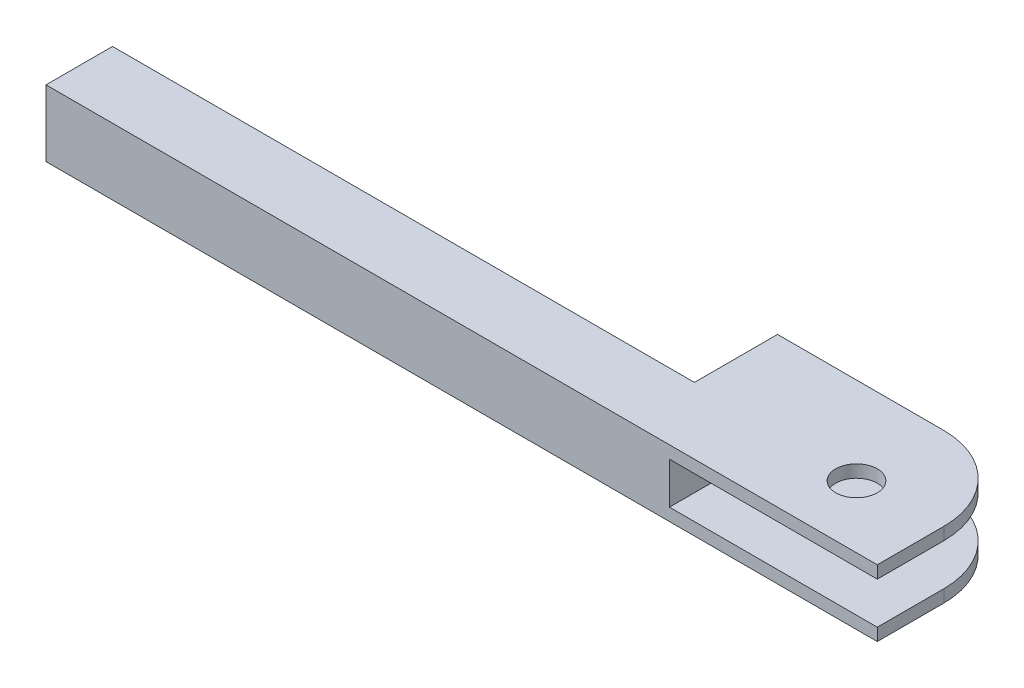
ISO-10303-21;
HEADER;
FILE_DESCRIPTION(('STEP AP214'),'2;1');
FILE_NAME('part.step','',(''),(''),'','','');
FILE_SCHEMA(('AUTOMOTIVE_DESIGN { 1 0 10303 214 1 1 1 1 }'));
ENDSEC;
DATA;
#1=APPLICATION_CONTEXT('core data for automotive mechanical design processes');
#2=APPLICATION_PROTOCOL_DEFINITION('international standard','automotive_design',2000,#1);
#3=PRODUCT_CONTEXT('',#1,'mechanical');
#4=PRODUCT('Part','Part','',(#3));
#5=PRODUCT_RELATED_PRODUCT_CATEGORY('part','',(#4));
#6=PRODUCT_DEFINITION_FORMATION('','',#4);
#7=PRODUCT_DEFINITION_CONTEXT('part definition',#1,'design');
#8=PRODUCT_DEFINITION('design','',#6,#7);
#9=PRODUCT_DEFINITION_SHAPE('','',#8);
#10=(LENGTH_UNIT() NAMED_UNIT(*) SI_UNIT(.MILLI.,.METRE.));
#11=(NAMED_UNIT(*) PLANE_ANGLE_UNIT() SI_UNIT($,.RADIAN.));
#12=(NAMED_UNIT(*) SI_UNIT($,.STERADIAN.) SOLID_ANGLE_UNIT());
#13=UNCERTAINTY_MEASURE_WITH_UNIT(LENGTH_MEASURE(1.E-05),#10,'distance_accuracy_value','');
#14=(GEOMETRIC_REPRESENTATION_CONTEXT(3) GLOBAL_UNCERTAINTY_ASSIGNED_CONTEXT((#13)) GLOBAL_UNIT_ASSIGNED_CONTEXT((#10,
#11,#12)) REPRESENTATION_CONTEXT('',''));
#15=CARTESIAN_POINT('',(0.,0.,0.));
#16=DIRECTION('',(0.,0.,1.));
#17=DIRECTION('',(1.,0.,0.));
#18=AXIS2_PLACEMENT_3D('',#15,#16,#17);
#19=CARTESIAN_POINT('',(100.,8.,-18.));
#20=DIRECTION('',(1.,0.,0.));
#21=DIRECTION('',(0.,0.,-1.));
#22=AXIS2_PLACEMENT_3D('',#19,#20,#21);
#23=PLANE('',#22);
#24=DIRECTION('',(0.,0.,1.));
#25=VECTOR('',#24,1.);
#26=CARTESIAN_POINT('',(100.,0.,-18.));
#27=LINE('',#26,#25);
#28=CARTESIAN_POINT('',(100.,0.,-8.));
#29=VERTEX_POINT('',#28);
#30=CARTESIAN_POINT('',(100.,0.,0.));
#31=VERTEX_POINT('',#30);
#32=EDGE_CURVE('E200',#29,#31,#27,.T.);
#33=ORIENTED_EDGE('',*,*,#32,.F.);
#34=DIRECTION('',(0.,-1.,0.));
#35=VECTOR('',#34,1.);
#36=CARTESIAN_POINT('',(100.,8.,-8.));
#37=LINE('',#36,#35);
#38=CARTESIAN_POINT('',(100.,1.5,-8.));
#39=VERTEX_POINT('',#38);
#40=EDGE_CURVE('E174',#29,#39,#37,.F.);
#41=ORIENTED_EDGE('',*,*,#40,.T.);
#42=DIRECTION('',(0.,0.,1.));
#43=VECTOR('',#42,1.);
#44=CARTESIAN_POINT('',(100.,1.5,-35.));
#45=LINE('',#44,#43);
#46=CARTESIAN_POINT('',(100.,1.5,0.));
#47=VERTEX_POINT('',#46);
#48=EDGE_CURVE('E185',#39,#47,#45,.T.);
#49=ORIENTED_EDGE('',*,*,#48,.T.);
#50=DIRECTION('',(0.,-1.,0.));
#51=VECTOR('',#50,1.);
#52=CARTESIAN_POINT('',(100.,8.,0.));
#53=LINE('',#52,#51);
#54=EDGE_CURVE('E141',#47,#31,#53,.T.);
#55=ORIENTED_EDGE('',*,*,#54,.T.);
#56=EDGE_LOOP('',(#33,#41,#49,#55));
#57=FACE_BOUND('',#56,.T.);
#58=ADVANCED_FACE('F33',(#57),#23,.T.);
#59=CARTESIAN_POINT('',(0.,8.,0.));
#60=DIRECTION('',(-1.,0.,0.));
#61=DIRECTION('',(0.,0.,1.));
#62=AXIS2_PLACEMENT_3D('',#59,#60,#61);
#63=PLANE('',#62);
#64=DIRECTION('',(0.,0.,-1.));
#65=VECTOR('',#64,1.);
#66=CARTESIAN_POINT('',(0.,0.,0.));
#67=LINE('',#66,#65);
#68=CARTESIAN_POINT('',(0.,0.,0.));
#69=VERTEX_POINT('',#68);
#70=CARTESIAN_POINT('',(0.,0.,-8.));
#71=VERTEX_POINT('',#70);
#72=EDGE_CURVE('E216',#69,#71,#67,.T.);
#73=ORIENTED_EDGE('',*,*,#72,.F.);
#74=DIRECTION('',(0.,-1.,0.));
#75=VECTOR('',#74,1.);
#76=CARTESIAN_POINT('',(0.,8.,0.));
#77=LINE('',#76,#75);
#78=CARTESIAN_POINT('',(0.,8.,0.));
#79=VERTEX_POINT('',#78);
#80=EDGE_CURVE('E140',#79,#69,#77,.T.);
#81=ORIENTED_EDGE('',*,*,#80,.F.);
#82=DIRECTION('',(0.,0.,-1.));
#83=VECTOR('',#82,1.);
#84=CARTESIAN_POINT('',(0.,8.,0.));
#85=LINE('',#84,#83);
#86=CARTESIAN_POINT('',(0.,8.,-8.));
#87=VERTEX_POINT('',#86);
#88=EDGE_CURVE('E208',#79,#87,#85,.T.);
#89=ORIENTED_EDGE('',*,*,#88,.T.);
#90=DIRECTION('',(0.,-1.,0.));
#91=VECTOR('',#90,1.);
#92=CARTESIAN_POINT('',(0.,8.,-8.));
#93=LINE('',#92,#91);
#94=EDGE_CURVE('E152',#87,#71,#93,.T.);
#95=ORIENTED_EDGE('',*,*,#94,.T.);
#96=EDGE_LOOP('',(#73,#81,#89,#95));
#97=FACE_BOUND('',#96,.T.);
#98=ADVANCED_FACE('F263',(#97),#63,.T.);
#99=CARTESIAN_POINT('',(100.,8.,0.));
#100=DIRECTION('',(0.,0.,1.));
#101=DIRECTION('',(1.,0.,0.));
#102=AXIS2_PLACEMENT_3D('',#99,#100,#101);
#103=PLANE('',#102);
#104=DIRECTION('',(1.,0.,0.));
#105=VECTOR('',#104,1.);
#106=CARTESIAN_POINT('',(100.,1.5,0.));
#107=LINE('',#106,#105);
#108=CARTESIAN_POINT('',(75.,1.5,0.));
#109=VERTEX_POINT('',#108);
#110=EDGE_CURVE('E125',#109,#47,#107,.T.);
#111=ORIENTED_EDGE('',*,*,#110,.F.);
#112=DIRECTION('',(0.,-1.,0.));
#113=VECTOR('',#112,1.);
#114=CARTESIAN_POINT('',(75.,6.5,0.));
#115=LINE('',#114,#113);
#116=CARTESIAN_POINT('',(75.,6.5,0.));
#117=VERTEX_POINT('',#116);
#118=EDGE_CURVE('E135',#117,#109,#115,.T.);
#119=ORIENTED_EDGE('',*,*,#118,.F.);
#120=DIRECTION('',(-1.,0.,0.));
#121=VECTOR('',#120,1.);
#122=CARTESIAN_POINT('',(100.,6.5,0.));
#123=LINE('',#122,#121);
#124=CARTESIAN_POINT('',(100.,6.5,0.));
#125=VERTEX_POINT('',#124);
#126=EDGE_CURVE('E121',#125,#117,#123,.T.);
#127=ORIENTED_EDGE('',*,*,#126,.F.);
#128=CARTESIAN_POINT('',(100.,8.,0.));
#129=VERTEX_POINT('',#128);
#130=EDGE_CURVE('E132',#129,#125,#53,.T.);
#131=ORIENTED_EDGE('',*,*,#130,.F.);
#132=DIRECTION('',(-1.,0.,0.));
#133=VECTOR('',#132,1.);
#134=CARTESIAN_POINT('',(100.,8.,0.));
#135=LINE('',#134,#133);
#136=EDGE_CURVE('E154',#129,#79,#135,.T.);
#137=ORIENTED_EDGE('',*,*,#136,.T.);
#138=ORIENTED_EDGE('',*,*,#80,.T.);
#139=DIRECTION('',(-1.,0.,0.));
#140=VECTOR('',#139,1.);
#141=CARTESIAN_POINT('',(100.,0.,0.));
#142=LINE('',#141,#140);
#143=EDGE_CURVE('E206',#31,#69,#142,.T.);
#144=ORIENTED_EDGE('',*,*,#143,.F.);
#145=ORIENTED_EDGE('',*,*,#54,.F.);
#146=EDGE_LOOP('',(#111,#119,#127,#131,#137,#138,#144,#145));
#147=FACE_BOUND('',#146,.T.);
#148=ADVANCED_FACE('F130',(#147),#103,.T.);
#149=DIRECTION('',(0.,0.,1.));
#150=VECTOR('',#149,1.);
#151=CARTESIAN_POINT('',(100.,6.5,-35.));
#152=LINE('',#151,#150);
#153=CARTESIAN_POINT('',(100.,6.5,-8.));
#154=VERTEX_POINT('',#153);
#155=EDGE_CURVE('E118',#154,#125,#152,.T.);
#156=ORIENTED_EDGE('',*,*,#155,.F.);
#157=DIRECTION('',(0.,-1.,0.));
#158=VECTOR('',#157,1.);
#159=CARTESIAN_POINT('',(100.,8.,-8.));
#160=LINE('',#159,#158);
#161=CARTESIAN_POINT('',(100.,8.,-8.));
#162=VERTEX_POINT('',#161);
#163=EDGE_CURVE('E41',#154,#162,#160,.F.);
#164=ORIENTED_EDGE('',*,*,#163,.T.);
#165=DIRECTION('',(0.,0.,1.));
#166=VECTOR('',#165,1.);
#167=CARTESIAN_POINT('',(100.,8.,-18.));
#168=LINE('',#167,#166);
#169=EDGE_CURVE('E139',#162,#129,#168,.T.);
#170=ORIENTED_EDGE('',*,*,#169,.T.);
#171=ORIENTED_EDGE('',*,*,#130,.T.);
#172=EDGE_LOOP('',(#156,#164,#170,#171));
#173=FACE_BOUND('',#172,.T.);
#174=ADVANCED_FACE('F138',(#173),#23,.T.);
#175=CARTESIAN_POINT('',(70.,8.,-18.));
#176=DIRECTION('',(0.,0.,-1.));
#177=DIRECTION('',(-1.,0.,0.));
#178=AXIS2_PLACEMENT_3D('',#175,#176,#177);
#179=PLANE('',#178);
#180=DIRECTION('',(-1.,0.,0.));
#181=VECTOR('',#180,1.);
#182=CARTESIAN_POINT('',(70.,1.5,-18.));
#183=LINE('',#182,#181);
#184=CARTESIAN_POINT('',(90.,1.5,-18.));
#185=VERTEX_POINT('',#184);
#186=CARTESIAN_POINT('',(75.,1.5,-18.));
#187=VERTEX_POINT('',#186);
#188=EDGE_CURVE('E159',#185,#187,#183,.T.);
#189=ORIENTED_EDGE('',*,*,#188,.F.);
#190=DIRECTION('',(0.,-1.,0.));
#191=VECTOR('',#190,1.);
#192=CARTESIAN_POINT('',(90.,8.,-18.));
#193=LINE('',#192,#191);
#194=CARTESIAN_POINT('',(90.,0.,-18.));
#195=VERTEX_POINT('',#194);
#196=EDGE_CURVE('E169',#185,#195,#193,.T.);
#197=ORIENTED_EDGE('',*,*,#196,.T.);
#198=DIRECTION('',(1.,0.,0.));
#199=VECTOR('',#198,1.);
#200=CARTESIAN_POINT('',(70.,0.,-18.));
#201=LINE('',#200,#199);
#202=CARTESIAN_POINT('',(70.,0.,-18.));
#203=VERTEX_POINT('',#202);
#204=EDGE_CURVE('E202',#203,#195,#201,.T.);
#205=ORIENTED_EDGE('',*,*,#204,.F.);
#206=DIRECTION('',(0.,-1.,0.));
#207=VECTOR('',#206,1.);
#208=CARTESIAN_POINT('',(70.,8.,-18.));
#209=LINE('',#208,#207);
#210=CARTESIAN_POINT('',(70.,8.,-18.));
#211=VERTEX_POINT('',#210);
#212=EDGE_CURVE('E146',#211,#203,#209,.T.);
#213=ORIENTED_EDGE('',*,*,#212,.F.);
#214=DIRECTION('',(1.,0.,0.));
#215=VECTOR('',#214,1.);
#216=CARTESIAN_POINT('',(70.,8.,-18.));
#217=LINE('',#216,#215);
#218=CARTESIAN_POINT('',(90.,8.,-18.));
#219=VERTEX_POINT('',#218);
#220=EDGE_CURVE('E221',#211,#219,#217,.T.);
#221=ORIENTED_EDGE('',*,*,#220,.T.);
#222=DIRECTION('',(0.,-1.,0.));
#223=VECTOR('',#222,1.);
#224=CARTESIAN_POINT('',(90.,8.,-18.));
#225=LINE('',#224,#223);
#226=CARTESIAN_POINT('',(90.,6.5,-18.));
#227=VERTEX_POINT('',#226);
#228=EDGE_CURVE('E161',#219,#227,#225,.T.);
#229=ORIENTED_EDGE('',*,*,#228,.T.);
#230=DIRECTION('',(1.,0.,0.));
#231=VECTOR('',#230,1.);
#232=CARTESIAN_POINT('',(70.,6.5,-18.));
#233=LINE('',#232,#231);
#234=CARTESIAN_POINT('',(75.,6.5,-18.));
#235=VERTEX_POINT('',#234);
#236=EDGE_CURVE('E143',#235,#227,#233,.T.);
#237=ORIENTED_EDGE('',*,*,#236,.F.);
#238=DIRECTION('',(0.,1.,0.));
#239=VECTOR('',#238,1.);
#240=CARTESIAN_POINT('',(75.,8.,-18.));
#241=LINE('',#240,#239);
#242=EDGE_CURVE('E156',#187,#235,#241,.T.);
#243=ORIENTED_EDGE('',*,*,#242,.F.);
#244=EDGE_LOOP('',(#189,#197,#205,#213,#221,#229,#237,#243));
#245=FACE_BOUND('',#244,.T.);
#246=ADVANCED_FACE('F191',(#245),#179,.T.);
#247=CARTESIAN_POINT('',(70.,8.,-8.));
#248=DIRECTION('',(-1.,0.,0.));
#249=DIRECTION('',(0.,0.,1.));
#250=AXIS2_PLACEMENT_3D('',#247,#248,#249);
#251=PLANE('',#250);
#252=DIRECTION('',(0.,0.,-1.));
#253=VECTOR('',#252,1.);
#254=CARTESIAN_POINT('',(70.,0.,-8.));
#255=LINE('',#254,#253);
#256=CARTESIAN_POINT('',(70.,0.,-8.));
#257=VERTEX_POINT('',#256);
#258=EDGE_CURVE('E209',#257,#203,#255,.T.);
#259=ORIENTED_EDGE('',*,*,#258,.F.);
#260=DIRECTION('',(0.,-1.,0.));
#261=VECTOR('',#260,1.);
#262=CARTESIAN_POINT('',(70.,8.,-8.));
#263=LINE('',#262,#261);
#264=CARTESIAN_POINT('',(70.,8.,-8.));
#265=VERTEX_POINT('',#264);
#266=EDGE_CURVE('E150',#265,#257,#263,.T.);
#267=ORIENTED_EDGE('',*,*,#266,.F.);
#268=DIRECTION('',(0.,0.,-1.));
#269=VECTOR('',#268,1.);
#270=CARTESIAN_POINT('',(70.,8.,-8.));
#271=LINE('',#270,#269);
#272=EDGE_CURVE('E224',#265,#211,#271,.T.);
#273=ORIENTED_EDGE('',*,*,#272,.T.);
#274=ORIENTED_EDGE('',*,*,#212,.T.);
#275=EDGE_LOOP('',(#259,#267,#273,#274));
#276=FACE_BOUND('',#275,.T.);
#277=ADVANCED_FACE('F269',(#276),#251,.T.);
#278=CARTESIAN_POINT('',(0.,8.,-8.));
#279=DIRECTION('',(0.,0.,-1.));
#280=DIRECTION('',(-1.,0.,0.));
#281=AXIS2_PLACEMENT_3D('',#278,#279,#280);
#282=PLANE('',#281);
#283=DIRECTION('',(1.,0.,0.));
#284=VECTOR('',#283,1.);
#285=CARTESIAN_POINT('',(0.,0.,-8.));
#286=LINE('',#285,#284);
#287=EDGE_CURVE('E213',#71,#257,#286,.T.);
#288=ORIENTED_EDGE('',*,*,#287,.F.);
#289=ORIENTED_EDGE('',*,*,#94,.F.);
#290=DIRECTION('',(1.,0.,0.));
#291=VECTOR('',#290,1.);
#292=CARTESIAN_POINT('',(0.,8.,-8.));
#293=LINE('',#292,#291);
#294=EDGE_CURVE('E227',#87,#265,#293,.T.);
#295=ORIENTED_EDGE('',*,*,#294,.T.);
#296=ORIENTED_EDGE('',*,*,#266,.T.);
#297=EDGE_LOOP('',(#288,#289,#295,#296));
#298=FACE_BOUND('',#297,.T.);
#299=ADVANCED_FACE('F251',(#298),#282,.T.);
#300=CARTESIAN_POINT('',(0.,8.,0.));
#301=DIRECTION('',(0.,-1.,0.));
#302=DIRECTION('',(0.,0.,-1.));
#303=AXIS2_PLACEMENT_3D('',#300,#301,#302);
#304=PLANE('',#303);
#305=CARTESIAN_POINT('',(90.,8.,-7.5));
#306=DIRECTION('',(0.,1.,0.));
#307=DIRECTION('',(0.,0.,1.));
#308=AXIS2_PLACEMENT_3D('',#305,#306,#307);
#309=CIRCLE('',#308,2.50000000000001);
#310=CARTESIAN_POINT('',(90.,8.,-4.99999999999999));
#311=VERTEX_POINT('',#310);
#312=EDGE_CURVE('E166',#311,#311,#309,.T.);
#313=ORIENTED_EDGE('',*,*,#312,.F.);
#314=EDGE_LOOP('',(#313));
#315=FACE_BOUND('',#314,.T.);
#316=ORIENTED_EDGE('',*,*,#169,.F.);
#317=CARTESIAN_POINT('',(90.,8.,-8.));
#318=DIRECTION('',(0.,-1.,0.));
#319=DIRECTION('',(0.,0.,-1.));
#320=AXIS2_PLACEMENT_3D('',#317,#318,#319);
#321=CIRCLE('',#320,10.);
#322=EDGE_CURVE('E11',#162,#219,#321,.F.);
#323=ORIENTED_EDGE('',*,*,#322,.T.);
#324=ORIENTED_EDGE('',*,*,#220,.F.);
#325=ORIENTED_EDGE('',*,*,#272,.F.);
#326=ORIENTED_EDGE('',*,*,#294,.F.);
#327=ORIENTED_EDGE('',*,*,#88,.F.);
#328=ORIENTED_EDGE('',*,*,#136,.F.);
#329=EDGE_LOOP('',(#316,#323,#324,#325,#326,#327,#328));
#330=FACE_BOUND('',#329,.T.);
#331=ADVANCED_FACE('F248',(#315,#330),#304,.F.);
#332=CARTESIAN_POINT('',(0.,0.,0.));
#333=DIRECTION('',(0.,-1.,0.));
#334=DIRECTION('',(0.,0.,-1.));
#335=AXIS2_PLACEMENT_3D('',#332,#333,#334);
#336=PLANE('',#335);
#337=CARTESIAN_POINT('',(90.,0.,-7.5));
#338=DIRECTION('',(0.,-1.,0.));
#339=DIRECTION('',(0.,0.,-1.));
#340=AXIS2_PLACEMENT_3D('',#337,#338,#339);
#341=CIRCLE('',#340,2.50000000000001);
#342=CARTESIAN_POINT('',(90.,0.,-10.));
#343=VERTEX_POINT('',#342);
#344=EDGE_CURVE('E136',#343,#343,#341,.T.);
#345=ORIENTED_EDGE('',*,*,#344,.F.);
#346=EDGE_LOOP('',(#345));
#347=FACE_BOUND('',#346,.T.);
#348=ORIENTED_EDGE('',*,*,#204,.T.);
#349=CARTESIAN_POINT('',(90.,0.,-8.));
#350=DIRECTION('',(0.,-1.,0.));
#351=DIRECTION('',(0.,0.,-1.));
#352=AXIS2_PLACEMENT_3D('',#349,#350,#351);
#353=CIRCLE('',#352,10.);
#354=EDGE_CURVE('E172',#195,#29,#353,.T.);
#355=ORIENTED_EDGE('',*,*,#354,.T.);
#356=ORIENTED_EDGE('',*,*,#32,.T.);
#357=ORIENTED_EDGE('',*,*,#143,.T.);
#358=ORIENTED_EDGE('',*,*,#72,.T.);
#359=ORIENTED_EDGE('',*,*,#287,.T.);
#360=ORIENTED_EDGE('',*,*,#258,.T.);
#361=EDGE_LOOP('',(#348,#355,#356,#357,#358,#359,#360));
#362=FACE_BOUND('',#361,.T.);
#363=ADVANCED_FACE('F198',(#347,#362),#336,.T.);
#364=CARTESIAN_POINT('',(100.,1.5,-35.));
#365=DIRECTION('',(0.,-1.,0.));
#366=DIRECTION('',(1.,0.,0.));
#367=AXIS2_PLACEMENT_3D('',#364,#365,#366);
#368=PLANE('',#367);
#369=CARTESIAN_POINT('',(90.,1.5,-7.5));
#370=DIRECTION('',(0.,-1.,0.));
#371=DIRECTION('',(1.,0.,0.));
#372=AXIS2_PLACEMENT_3D('',#369,#370,#371);
#373=CIRCLE('',#372,2.50000000000001);
#374=CARTESIAN_POINT('',(92.5,1.5,-7.5));
#375=VERTEX_POINT('',#374);
#376=EDGE_CURVE('E165',#375,#375,#373,.T.);
#377=ORIENTED_EDGE('',*,*,#376,.T.);
#378=EDGE_LOOP('',(#377));
#379=FACE_BOUND('',#378,.T.);
#380=ORIENTED_EDGE('',*,*,#48,.F.);
#381=CARTESIAN_POINT('',(90.,1.5,-8.));
#382=DIRECTION('',(0.,-1.,0.));
#383=DIRECTION('',(1.,0.,0.));
#384=AXIS2_PLACEMENT_3D('',#381,#382,#383);
#385=CIRCLE('',#384,10.);
#386=EDGE_CURVE('E176',#39,#185,#385,.F.);
#387=ORIENTED_EDGE('',*,*,#386,.T.);
#388=ORIENTED_EDGE('',*,*,#188,.T.);
#389=DIRECTION('',(0.,0.,1.));
#390=VECTOR('',#389,1.);
#391=CARTESIAN_POINT('',(75.,1.5,-35.));
#392=LINE('',#391,#390);
#393=EDGE_CURVE('E233',#187,#109,#392,.T.);
#394=ORIENTED_EDGE('',*,*,#393,.T.);
#395=ORIENTED_EDGE('',*,*,#110,.T.);
#396=EDGE_LOOP('',(#380,#387,#388,#394,#395));
#397=FACE_BOUND('',#396,.T.);
#398=ADVANCED_FACE('F182',(#379,#397),#368,.F.);
#399=CARTESIAN_POINT('',(75.,6.5,-35.));
#400=DIRECTION('',(-1.,0.,0.));
#401=DIRECTION('',(0.,0.,1.));
#402=AXIS2_PLACEMENT_3D('',#399,#400,#401);
#403=PLANE('',#402);
#404=ORIENTED_EDGE('',*,*,#242,.T.);
#405=DIRECTION('',(0.,0.,1.));
#406=VECTOR('',#405,1.);
#407=CARTESIAN_POINT('',(75.,6.5,-35.));
#408=LINE('',#407,#406);
#409=EDGE_CURVE('E124',#235,#117,#408,.T.);
#410=ORIENTED_EDGE('',*,*,#409,.T.);
#411=ORIENTED_EDGE('',*,*,#118,.T.);
#412=ORIENTED_EDGE('',*,*,#393,.F.);
#413=EDGE_LOOP('',(#404,#410,#411,#412));
#414=FACE_BOUND('',#413,.T.);
#415=ADVANCED_FACE('F259',(#414),#403,.F.);
#416=CARTESIAN_POINT('',(100.,6.5,-35.));
#417=DIRECTION('',(0.,1.,0.));
#418=DIRECTION('',(-1.,0.,0.));
#419=AXIS2_PLACEMENT_3D('',#416,#417,#418);
#420=PLANE('',#419);
#421=CARTESIAN_POINT('',(90.,6.5,-7.5));
#422=DIRECTION('',(0.,1.,0.));
#423=DIRECTION('',(-1.,0.,0.));
#424=AXIS2_PLACEMENT_3D('',#421,#422,#423);
#425=CIRCLE('',#424,2.50000000000001);
#426=CARTESIAN_POINT('',(87.5,6.5,-7.5));
#427=VERTEX_POINT('',#426);
#428=EDGE_CURVE('E162',#427,#427,#425,.T.);
#429=ORIENTED_EDGE('',*,*,#428,.T.);
#430=EDGE_LOOP('',(#429));
#431=FACE_BOUND('',#430,.T.);
#432=ORIENTED_EDGE('',*,*,#236,.T.);
#433=CARTESIAN_POINT('',(90.,6.5,-8.));
#434=DIRECTION('',(0.,1.,0.));
#435=DIRECTION('',(-1.,0.,0.));
#436=AXIS2_PLACEMENT_3D('',#433,#434,#435);
#437=CIRCLE('',#436,10.);
#438=EDGE_CURVE('E55',#227,#154,#437,.F.);
#439=ORIENTED_EDGE('',*,*,#438,.T.);
#440=ORIENTED_EDGE('',*,*,#155,.T.);
#441=ORIENTED_EDGE('',*,*,#126,.T.);
#442=ORIENTED_EDGE('',*,*,#409,.F.);
#443=EDGE_LOOP('',(#432,#439,#440,#441,#442));
#444=FACE_BOUND('',#443,.T.);
#445=ADVANCED_FACE('F120',(#431,#444),#420,.F.);
#446=CARTESIAN_POINT('',(90.,-27.,-7.5));
#447=DIRECTION('',(0.,1.,0.));
#448=DIRECTION('',(0.,0.,1.));
#449=AXIS2_PLACEMENT_3D('',#446,#447,#448);
#450=CYLINDRICAL_SURFACE('',#449,2.50000000000001);
#451=ORIENTED_EDGE('',*,*,#312,.T.);
#452=EDGE_LOOP('',(#451));
#453=FACE_BOUND('',#452,.T.);
#454=ORIENTED_EDGE('',*,*,#428,.F.);
#455=EDGE_LOOP('',(#454));
#456=FACE_BOUND('',#455,.T.);
#457=ADVANCED_FACE('F245',(#453,#456),#450,.F.);
#458=ORIENTED_EDGE('',*,*,#344,.T.);
#459=EDGE_LOOP('',(#458));
#460=FACE_BOUND('',#459,.T.);
#461=ORIENTED_EDGE('',*,*,#376,.F.);
#462=EDGE_LOOP('',(#461));
#463=FACE_BOUND('',#462,.T.);
#464=ADVANCED_FACE('F303',(#460,#463),#450,.F.);
#465=CARTESIAN_POINT('',(90.,8.,-8.));
#466=DIRECTION('',(0.,-1.,0.));
#467=DIRECTION('',(0.,0.,-1.));
#468=AXIS2_PLACEMENT_3D('',#465,#466,#467);
#469=CYLINDRICAL_SURFACE('',#468,10.);
#470=ORIENTED_EDGE('',*,*,#386,.F.);
#471=ORIENTED_EDGE('',*,*,#40,.F.);
#472=ORIENTED_EDGE('',*,*,#354,.F.);
#473=ORIENTED_EDGE('',*,*,#196,.F.);
#474=EDGE_LOOP('',(#470,#471,#472,#473));
#475=FACE_BOUND('',#474,.T.);
#476=ADVANCED_FACE('F195',(#475),#469,.T.);
#477=CARTESIAN_POINT('',(90.,8.,-8.));
#478=DIRECTION('',(0.,-1.,0.));
#479=DIRECTION('',(0.,0.,-1.));
#480=AXIS2_PLACEMENT_3D('',#477,#478,#479);
#481=CYLINDRICAL_SURFACE('',#480,10.);
#482=ORIENTED_EDGE('',*,*,#322,.F.);
#483=ORIENTED_EDGE('',*,*,#163,.F.);
#484=ORIENTED_EDGE('',*,*,#438,.F.);
#485=ORIENTED_EDGE('',*,*,#228,.F.);
#486=EDGE_LOOP('',(#482,#483,#484,#485));
#487=FACE_BOUND('',#486,.T.);
#488=ADVANCED_FACE('F35',(#487),#481,.T.);
#489=CLOSED_SHELL('',(#58,#98,#148,#174,#246,#277,#299,#331,#363,#398,#415,#445,#457,#464,#476,#488));
#490=MANIFOLD_SOLID_BREP('B2',#489);
#491=ADVANCED_BREP_SHAPE_REPRESENTATION('',(#18,#490),#14);
#492=SHAPE_DEFINITION_REPRESENTATION(#9,#491);
ENDSEC;
END-ISO-10303-21;
